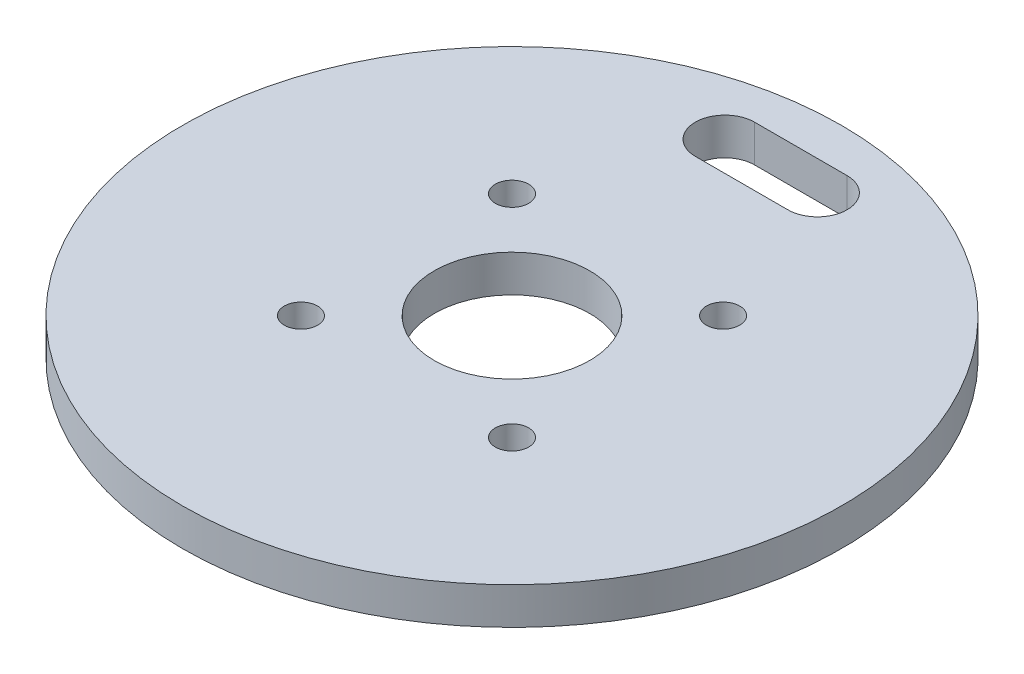
ISO-10303-21;
HEADER;
FILE_DESCRIPTION(('STEP AP214'),'2;1');
FILE_NAME('part.step','',(''),(''),'','','');
FILE_SCHEMA(('AUTOMOTIVE_DESIGN { 1 0 10303 214 1 1 1 1 }'));
ENDSEC;
DATA;
#1=APPLICATION_CONTEXT('core data for automotive mechanical design processes');
#2=APPLICATION_PROTOCOL_DEFINITION('international standard','automotive_design',2000,#1);
#3=PRODUCT_CONTEXT('',#1,'mechanical');
#4=PRODUCT('Part','Part','',(#3));
#5=PRODUCT_RELATED_PRODUCT_CATEGORY('part','',(#4));
#6=PRODUCT_DEFINITION_FORMATION('','',#4);
#7=PRODUCT_DEFINITION_CONTEXT('part definition',#1,'design');
#8=PRODUCT_DEFINITION('design','',#6,#7);
#9=PRODUCT_DEFINITION_SHAPE('','',#8);
#10=(LENGTH_UNIT() NAMED_UNIT(*) SI_UNIT(.MILLI.,.METRE.));
#11=(NAMED_UNIT(*) PLANE_ANGLE_UNIT() SI_UNIT($,.RADIAN.));
#12=(NAMED_UNIT(*) SI_UNIT($,.STERADIAN.) SOLID_ANGLE_UNIT());
#13=UNCERTAINTY_MEASURE_WITH_UNIT(LENGTH_MEASURE(1.E-05),#10,'distance_accuracy_value','');
#14=(GEOMETRIC_REPRESENTATION_CONTEXT(3) GLOBAL_UNCERTAINTY_ASSIGNED_CONTEXT((#13)) GLOBAL_UNIT_ASSIGNED_CONTEXT((#10,
#11,#12)) REPRESENTATION_CONTEXT('',''));
#15=CARTESIAN_POINT('',(0.,0.,0.));
#16=DIRECTION('',(0.,0.,1.));
#17=DIRECTION('',(1.,0.,0.));
#18=AXIS2_PLACEMENT_3D('',#15,#16,#17);
#19=CARTESIAN_POINT('',(0.,5.,0.));
#20=DIRECTION('',(0.,1.,0.));
#21=DIRECTION('',(0.,0.,1.));
#22=AXIS2_PLACEMENT_3D('',#19,#20,#21);
#23=PLANE('',#22);
#24=CARTESIAN_POINT('',(-14.25,5.,-14.25));
#25=DIRECTION('',(0.,1.,0.));
#26=DIRECTION('',(0.,0.,1.));
#27=AXIS2_PLACEMENT_3D('',#24,#25,#26);
#28=CIRCLE('',#27,2.25);
#29=CARTESIAN_POINT('',(-14.25,5.,-12.));
#30=VERTEX_POINT('',#29);
#31=EDGE_CURVE('E144',#30,#30,#28,.T.);
#32=ORIENTED_EDGE('',*,*,#31,.F.);
#33=EDGE_LOOP('',(#32));
#34=FACE_BOUND('',#33,.T.);
#35=CARTESIAN_POINT('',(14.25,5.,14.25));
#36=DIRECTION('',(0.,1.,0.));
#37=DIRECTION('',(0.,0.,1.));
#38=AXIS2_PLACEMENT_3D('',#35,#36,#37);
#39=CIRCLE('',#38,2.25);
#40=CARTESIAN_POINT('',(14.25,5.,16.5));
#41=VERTEX_POINT('',#40);
#42=EDGE_CURVE('E148',#41,#41,#39,.T.);
#43=ORIENTED_EDGE('',*,*,#42,.F.);
#44=EDGE_LOOP('',(#43));
#45=FACE_BOUND('',#44,.T.);
#46=CARTESIAN_POINT('',(14.25,5.,-14.25));
#47=DIRECTION('',(0.,1.,0.));
#48=DIRECTION('',(0.,0.,1.));
#49=AXIS2_PLACEMENT_3D('',#46,#47,#48);
#50=CIRCLE('',#49,2.25);
#51=CARTESIAN_POINT('',(14.25,5.,-12.));
#52=VERTEX_POINT('',#51);
#53=EDGE_CURVE('E152',#52,#52,#50,.T.);
#54=ORIENTED_EDGE('',*,*,#53,.F.);
#55=EDGE_LOOP('',(#54));
#56=FACE_BOUND('',#55,.T.);
#57=CARTESIAN_POINT('',(-14.25,5.,14.25));
#58=DIRECTION('',(0.,1.,0.));
#59=DIRECTION('',(0.,0.,1.));
#60=AXIS2_PLACEMENT_3D('',#57,#58,#59);
#61=CIRCLE('',#60,2.25);
#62=CARTESIAN_POINT('',(-14.25,5.,16.5));
#63=VERTEX_POINT('',#62);
#64=EDGE_CURVE('E156',#63,#63,#61,.T.);
#65=ORIENTED_EDGE('',*,*,#64,.F.);
#66=EDGE_LOOP('',(#65));
#67=FACE_BOUND('',#66,.T.);
#68=CARTESIAN_POINT('',(-6.25,5.,-35.));
#69=DIRECTION('',(0.,1.,0.));
#70=DIRECTION('',(0.,0.,1.));
#71=AXIS2_PLACEMENT_3D('',#68,#69,#70);
#72=CIRCLE('',#71,4.00000000000001);
#73=CARTESIAN_POINT('',(-6.25,5.,-39.));
#74=VERTEX_POINT('',#73);
#75=CARTESIAN_POINT('',(-6.25,5.,-31.));
#76=VERTEX_POINT('',#75);
#77=EDGE_CURVE('E50',#74,#76,#72,.T.);
#78=ORIENTED_EDGE('',*,*,#77,.F.);
#79=DIRECTION('',(-1.,0.,0.));
#80=VECTOR('',#79,1.);
#81=CARTESIAN_POINT('',(-6.25,5.,-39.));
#82=LINE('',#81,#80);
#83=CARTESIAN_POINT('',(6.25,5.,-39.));
#84=VERTEX_POINT('',#83);
#85=EDGE_CURVE('E94',#84,#74,#82,.T.);
#86=ORIENTED_EDGE('',*,*,#85,.F.);
#87=CARTESIAN_POINT('',(6.25,5.,-35.));
#88=DIRECTION('',(0.,1.,0.));
#89=DIRECTION('',(0.,0.,1.));
#90=AXIS2_PLACEMENT_3D('',#87,#88,#89);
#91=CIRCLE('',#90,4.00000000000001);
#92=CARTESIAN_POINT('',(6.25,5.,-31.));
#93=VERTEX_POINT('',#92);
#94=EDGE_CURVE('E97',#93,#84,#91,.T.);
#95=ORIENTED_EDGE('',*,*,#94,.F.);
#96=DIRECTION('',(1.,0.,0.));
#97=VECTOR('',#96,1.);
#98=CARTESIAN_POINT('',(-6.25,5.,-31.));
#99=LINE('',#98,#97);
#100=EDGE_CURVE('E106',#76,#93,#99,.T.);
#101=ORIENTED_EDGE('',*,*,#100,.F.);
#102=EDGE_LOOP('',(#78,#86,#95,#101));
#103=FACE_BOUND('',#102,.T.);
#104=CARTESIAN_POINT('',(0.,5.,0.));
#105=DIRECTION('',(0.,1.,0.));
#106=DIRECTION('',(0.,0.,1.));
#107=AXIS2_PLACEMENT_3D('',#104,#105,#106);
#108=CIRCLE('',#107,44.5);
#109=CARTESIAN_POINT('',(0.,5.,44.5));
#110=VERTEX_POINT('',#109);
#111=EDGE_CURVE('E11',#110,#110,#108,.T.);
#112=ORIENTED_EDGE('',*,*,#111,.T.);
#113=EDGE_LOOP('',(#112));
#114=FACE_BOUND('',#113,.T.);
#115=CARTESIAN_POINT('',(0.,5.,0.));
#116=DIRECTION('',(0.,1.,0.));
#117=DIRECTION('',(0.,0.,1.));
#118=AXIS2_PLACEMENT_3D('',#115,#116,#117);
#119=CIRCLE('',#118,10.5);
#120=CARTESIAN_POINT('',(0.,5.,10.5));
#121=VERTEX_POINT('',#120);
#122=EDGE_CURVE('E116',#121,#121,#119,.T.);
#123=ORIENTED_EDGE('',*,*,#122,.F.);
#124=EDGE_LOOP('',(#123));
#125=FACE_BOUND('',#124,.T.);
#126=ADVANCED_FACE('F35',(#34,#45,#56,#67,#103,#114,#125),#23,.T.);
#127=CARTESIAN_POINT('',(0.,0.,0.));
#128=DIRECTION('',(0.,1.,0.));
#129=DIRECTION('',(0.,0.,1.));
#130=AXIS2_PLACEMENT_3D('',#127,#128,#129);
#131=PLANE('',#130);
#132=CARTESIAN_POINT('',(-14.25,0.,-14.25));
#133=DIRECTION('',(0.,1.,0.));
#134=DIRECTION('',(0.,0.,1.));
#135=AXIS2_PLACEMENT_3D('',#132,#133,#134);
#136=CIRCLE('',#135,2.25);
#137=CARTESIAN_POINT('',(-14.25,0.,-12.));
#138=VERTEX_POINT('',#137);
#139=EDGE_CURVE('E201',#138,#138,#136,.T.);
#140=ORIENTED_EDGE('',*,*,#139,.T.);
#141=EDGE_LOOP('',(#140));
#142=FACE_BOUND('',#141,.T.);
#143=CARTESIAN_POINT('',(14.25,0.,14.25));
#144=DIRECTION('',(0.,1.,0.));
#145=DIRECTION('',(0.,0.,1.));
#146=AXIS2_PLACEMENT_3D('',#143,#144,#145);
#147=CIRCLE('',#146,2.25);
#148=CARTESIAN_POINT('',(14.25,0.,16.5));
#149=VERTEX_POINT('',#148);
#150=EDGE_CURVE('E197',#149,#149,#147,.T.);
#151=ORIENTED_EDGE('',*,*,#150,.T.);
#152=EDGE_LOOP('',(#151));
#153=FACE_BOUND('',#152,.T.);
#154=CARTESIAN_POINT('',(14.25,0.,-14.25));
#155=DIRECTION('',(0.,1.,0.));
#156=DIRECTION('',(0.,0.,1.));
#157=AXIS2_PLACEMENT_3D('',#154,#155,#156);
#158=CIRCLE('',#157,2.25);
#159=CARTESIAN_POINT('',(14.25,0.,-12.));
#160=VERTEX_POINT('',#159);
#161=EDGE_CURVE('E192',#160,#160,#158,.T.);
#162=ORIENTED_EDGE('',*,*,#161,.T.);
#163=EDGE_LOOP('',(#162));
#164=FACE_BOUND('',#163,.T.);
#165=CARTESIAN_POINT('',(-14.25,0.,14.25));
#166=DIRECTION('',(0.,1.,0.));
#167=DIRECTION('',(0.,0.,1.));
#168=AXIS2_PLACEMENT_3D('',#165,#166,#167);
#169=CIRCLE('',#168,2.25);
#170=CARTESIAN_POINT('',(-14.25,0.,16.5));
#171=VERTEX_POINT('',#170);
#172=EDGE_CURVE('E100',#171,#171,#169,.T.);
#173=ORIENTED_EDGE('',*,*,#172,.T.);
#174=EDGE_LOOP('',(#173));
#175=FACE_BOUND('',#174,.T.);
#176=DIRECTION('',(-1.,0.,0.));
#177=VECTOR('',#176,1.);
#178=CARTESIAN_POINT('',(-6.25,0.,-39.));
#179=LINE('',#178,#177);
#180=CARTESIAN_POINT('',(6.25,0.,-39.));
#181=VERTEX_POINT('',#180);
#182=CARTESIAN_POINT('',(-6.25,0.,-39.));
#183=VERTEX_POINT('',#182);
#184=EDGE_CURVE('E84',#181,#183,#179,.T.);
#185=ORIENTED_EDGE('',*,*,#184,.T.);
#186=CARTESIAN_POINT('',(-6.25,0.,-35.));
#187=DIRECTION('',(0.,1.,0.));
#188=DIRECTION('',(0.,0.,1.));
#189=AXIS2_PLACEMENT_3D('',#186,#187,#188);
#190=CIRCLE('',#189,4.00000000000001);
#191=CARTESIAN_POINT('',(-6.25,0.,-31.));
#192=VERTEX_POINT('',#191);
#193=EDGE_CURVE('E78',#183,#192,#190,.T.);
#194=ORIENTED_EDGE('',*,*,#193,.T.);
#195=DIRECTION('',(1.,0.,0.));
#196=VECTOR('',#195,1.);
#197=CARTESIAN_POINT('',(-6.25,0.,-31.));
#198=LINE('',#197,#196);
#199=CARTESIAN_POINT('',(6.25,0.,-31.));
#200=VERTEX_POINT('',#199);
#201=EDGE_CURVE('E87',#192,#200,#198,.T.);
#202=ORIENTED_EDGE('',*,*,#201,.T.);
#203=CARTESIAN_POINT('',(6.25,0.,-35.));
#204=DIRECTION('',(0.,1.,0.));
#205=DIRECTION('',(0.,0.,1.));
#206=AXIS2_PLACEMENT_3D('',#203,#204,#205);
#207=CIRCLE('',#206,4.00000000000001);
#208=EDGE_CURVE('E58',#200,#181,#207,.T.);
#209=ORIENTED_EDGE('',*,*,#208,.T.);
#210=EDGE_LOOP('',(#185,#194,#202,#209));
#211=FACE_BOUND('',#210,.T.);
#212=CARTESIAN_POINT('',(0.,0.,0.));
#213=DIRECTION('',(0.,1.,0.));
#214=DIRECTION('',(0.,0.,1.));
#215=AXIS2_PLACEMENT_3D('',#212,#213,#214);
#216=CIRCLE('',#215,44.5);
#217=CARTESIAN_POINT('',(0.,0.,44.5));
#218=VERTEX_POINT('',#217);
#219=EDGE_CURVE('E39',#218,#218,#216,.T.);
#220=ORIENTED_EDGE('',*,*,#219,.F.);
#221=EDGE_LOOP('',(#220));
#222=FACE_BOUND('',#221,.T.);
#223=CARTESIAN_POINT('',(0.,0.,0.));
#224=DIRECTION('',(0.,1.,0.));
#225=DIRECTION('',(0.,0.,1.));
#226=AXIS2_PLACEMENT_3D('',#223,#224,#225);
#227=CIRCLE('',#226,10.5);
#228=CARTESIAN_POINT('',(0.,0.,10.5));
#229=VERTEX_POINT('',#228);
#230=EDGE_CURVE('E112',#229,#229,#227,.T.);
#231=ORIENTED_EDGE('',*,*,#230,.T.);
#232=EDGE_LOOP('',(#231));
#233=FACE_BOUND('',#232,.T.);
#234=ADVANCED_FACE('F91',(#142,#153,#164,#175,#211,#222,#233),#131,.F.);
#235=CARTESIAN_POINT('',(0.,5.,0.));
#236=DIRECTION('',(0.,-1.,0.));
#237=DIRECTION('',(0.,0.,-1.));
#238=AXIS2_PLACEMENT_3D('',#235,#236,#237);
#239=CYLINDRICAL_SURFACE('',#238,44.5);
#240=ORIENTED_EDGE('',*,*,#111,.F.);
#241=EDGE_LOOP('',(#240));
#242=FACE_BOUND('',#241,.T.);
#243=ORIENTED_EDGE('',*,*,#219,.T.);
#244=EDGE_LOOP('',(#243));
#245=FACE_BOUND('',#244,.T.);
#246=ADVANCED_FACE('F37',(#242,#245),#239,.T.);
#247=CARTESIAN_POINT('',(0.,5.,0.));
#248=DIRECTION('',(0.,-1.,0.));
#249=DIRECTION('',(0.,0.,-1.));
#250=AXIS2_PLACEMENT_3D('',#247,#248,#249);
#251=CYLINDRICAL_SURFACE('',#250,10.5);
#252=ORIENTED_EDGE('',*,*,#122,.T.);
#253=EDGE_LOOP('',(#252));
#254=FACE_BOUND('',#253,.T.);
#255=ORIENTED_EDGE('',*,*,#230,.F.);
#256=EDGE_LOOP('',(#255));
#257=FACE_BOUND('',#256,.T.);
#258=ADVANCED_FACE('F123',(#254,#257),#251,.F.);
#259=CARTESIAN_POINT('',(-6.25,0.,-35.));
#260=DIRECTION('',(0.,1.,0.));
#261=DIRECTION('',(0.,0.,1.));
#262=AXIS2_PLACEMENT_3D('',#259,#260,#261);
#263=CYLINDRICAL_SURFACE('',#262,4.00000000000001);
#264=ORIENTED_EDGE('',*,*,#77,.T.);
#265=DIRECTION('',(0.,1.,0.));
#266=VECTOR('',#265,1.);
#267=CARTESIAN_POINT('',(-6.25,0.,-31.));
#268=LINE('',#267,#266);
#269=EDGE_CURVE('E74',#192,#76,#268,.T.);
#270=ORIENTED_EDGE('',*,*,#269,.F.);
#271=ORIENTED_EDGE('',*,*,#193,.F.);
#272=DIRECTION('',(0.,1.,0.));
#273=VECTOR('',#272,1.);
#274=CARTESIAN_POINT('',(-6.25,0.,-39.));
#275=LINE('',#274,#273);
#276=EDGE_CURVE('E110',#183,#74,#275,.T.);
#277=ORIENTED_EDGE('',*,*,#276,.T.);
#278=EDGE_LOOP('',(#264,#270,#271,#277));
#279=FACE_BOUND('',#278,.T.);
#280=ADVANCED_FACE('F76',(#279),#263,.F.);
#281=CARTESIAN_POINT('',(-6.25,0.,-39.));
#282=DIRECTION('',(0.,0.,-1.));
#283=DIRECTION('',(-1.,0.,0.));
#284=AXIS2_PLACEMENT_3D('',#281,#282,#283);
#285=PLANE('',#284);
#286=ORIENTED_EDGE('',*,*,#85,.T.);
#287=ORIENTED_EDGE('',*,*,#276,.F.);
#288=ORIENTED_EDGE('',*,*,#184,.F.);
#289=DIRECTION('',(0.,1.,0.));
#290=VECTOR('',#289,1.);
#291=CARTESIAN_POINT('',(6.25,0.,-39.));
#292=LINE('',#291,#290);
#293=EDGE_CURVE('E113',#181,#84,#292,.T.);
#294=ORIENTED_EDGE('',*,*,#293,.T.);
#295=EDGE_LOOP('',(#286,#287,#288,#294));
#296=FACE_BOUND('',#295,.T.);
#297=ADVANCED_FACE('F131',(#296),#285,.F.);
#298=CARTESIAN_POINT('',(6.25,0.,-35.));
#299=DIRECTION('',(0.,1.,0.));
#300=DIRECTION('',(0.,0.,1.));
#301=AXIS2_PLACEMENT_3D('',#298,#299,#300);
#302=CYLINDRICAL_SURFACE('',#301,4.00000000000001);
#303=ORIENTED_EDGE('',*,*,#94,.T.);
#304=ORIENTED_EDGE('',*,*,#293,.F.);
#305=ORIENTED_EDGE('',*,*,#208,.F.);
#306=DIRECTION('',(0.,1.,0.));
#307=VECTOR('',#306,1.);
#308=CARTESIAN_POINT('',(6.25,0.,-31.));
#309=LINE('',#308,#307);
#310=EDGE_CURVE('E83',#200,#93,#309,.T.);
#311=ORIENTED_EDGE('',*,*,#310,.T.);
#312=EDGE_LOOP('',(#303,#304,#305,#311));
#313=FACE_BOUND('',#312,.T.);
#314=ADVANCED_FACE('F166',(#313),#302,.F.);
#315=CARTESIAN_POINT('',(-6.25,0.,-31.));
#316=DIRECTION('',(0.,0.,1.));
#317=DIRECTION('',(1.,0.,0.));
#318=AXIS2_PLACEMENT_3D('',#315,#316,#317);
#319=PLANE('',#318);
#320=ORIENTED_EDGE('',*,*,#100,.T.);
#321=ORIENTED_EDGE('',*,*,#310,.F.);
#322=ORIENTED_EDGE('',*,*,#201,.F.);
#323=ORIENTED_EDGE('',*,*,#269,.T.);
#324=EDGE_LOOP('',(#320,#321,#322,#323));
#325=FACE_BOUND('',#324,.T.);
#326=ADVANCED_FACE('F88',(#325),#319,.F.);
#327=CARTESIAN_POINT('',(-14.25,5.,14.25));
#328=DIRECTION('',(0.,1.,0.));
#329=DIRECTION('',(0.,0.,1.));
#330=AXIS2_PLACEMENT_3D('',#327,#328,#329);
#331=CYLINDRICAL_SURFACE('',#330,2.25);
#332=ORIENTED_EDGE('',*,*,#172,.F.);
#333=EDGE_LOOP('',(#332));
#334=FACE_BOUND('',#333,.T.);
#335=ORIENTED_EDGE('',*,*,#64,.T.);
#336=EDGE_LOOP('',(#335));
#337=FACE_BOUND('',#336,.T.);
#338=ADVANCED_FACE('F175',(#334,#337),#331,.F.);
#339=CARTESIAN_POINT('',(14.25,5.,-14.25));
#340=DIRECTION('',(0.,1.,0.));
#341=DIRECTION('',(0.,0.,1.));
#342=AXIS2_PLACEMENT_3D('',#339,#340,#341);
#343=CYLINDRICAL_SURFACE('',#342,2.25);
#344=ORIENTED_EDGE('',*,*,#161,.F.);
#345=EDGE_LOOP('',(#344));
#346=FACE_BOUND('',#345,.T.);
#347=ORIENTED_EDGE('',*,*,#53,.T.);
#348=EDGE_LOOP('',(#347));
#349=FACE_BOUND('',#348,.T.);
#350=ADVANCED_FACE('F182',(#346,#349),#343,.F.);
#351=CARTESIAN_POINT('',(14.25,5.,14.25));
#352=DIRECTION('',(0.,1.,0.));
#353=DIRECTION('',(0.,0.,1.));
#354=AXIS2_PLACEMENT_3D('',#351,#352,#353);
#355=CYLINDRICAL_SURFACE('',#354,2.25);
#356=ORIENTED_EDGE('',*,*,#150,.F.);
#357=EDGE_LOOP('',(#356));
#358=FACE_BOUND('',#357,.T.);
#359=ORIENTED_EDGE('',*,*,#42,.T.);
#360=EDGE_LOOP('',(#359));
#361=FACE_BOUND('',#360,.T.);
#362=ADVANCED_FACE('F187',(#358,#361),#355,.F.);
#363=CARTESIAN_POINT('',(-14.25,5.,-14.25));
#364=DIRECTION('',(0.,1.,0.));
#365=DIRECTION('',(0.,0.,1.));
#366=AXIS2_PLACEMENT_3D('',#363,#364,#365);
#367=CYLINDRICAL_SURFACE('',#366,2.25);
#368=ORIENTED_EDGE('',*,*,#139,.F.);
#369=EDGE_LOOP('',(#368));
#370=FACE_BOUND('',#369,.T.);
#371=ORIENTED_EDGE('',*,*,#31,.T.);
#372=EDGE_LOOP('',(#371));
#373=FACE_BOUND('',#372,.T.);
#374=ADVANCED_FACE('F205',(#370,#373),#367,.F.);
#375=CLOSED_SHELL('',(#126,#234,#246,#258,#280,#297,#314,#326,#338,#350,#362,#374));
#376=MANIFOLD_SOLID_BREP('B2',#375);
#377=ADVANCED_BREP_SHAPE_REPRESENTATION('',(#18,#376),#14);
#378=SHAPE_DEFINITION_REPRESENTATION(#9,#377);
ENDSEC;
END-ISO-10303-21;
